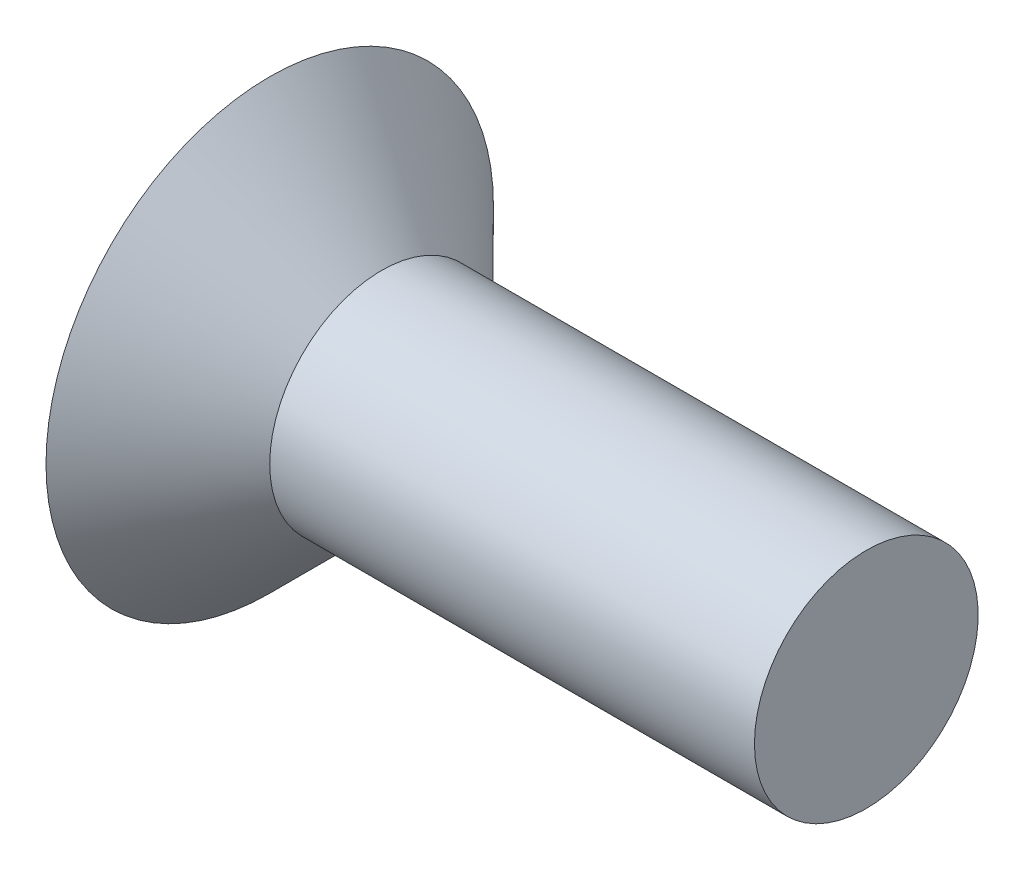
ISO-10303-21;
HEADER;
FILE_DESCRIPTION(('STEP AP214'),'2;1');
FILE_NAME('part.step','',(''),(''),'','','');
FILE_SCHEMA(('AUTOMOTIVE_DESIGN { 1 0 10303 214 1 1 1 1 }'));
ENDSEC;
DATA;
#1=APPLICATION_CONTEXT('core data for automotive mechanical design processes');
#2=APPLICATION_PROTOCOL_DEFINITION('international standard','automotive_design',2000,#1);
#3=PRODUCT_CONTEXT('',#1,'mechanical');
#4=PRODUCT('Part','Part','',(#3));
#5=PRODUCT_RELATED_PRODUCT_CATEGORY('part','',(#4));
#6=PRODUCT_DEFINITION_FORMATION('','',#4);
#7=PRODUCT_DEFINITION_CONTEXT('part definition',#1,'design');
#8=PRODUCT_DEFINITION('design','',#6,#7);
#9=PRODUCT_DEFINITION_SHAPE('','',#8);
#10=(LENGTH_UNIT() NAMED_UNIT(*) SI_UNIT(.MILLI.,.METRE.));
#11=(NAMED_UNIT(*) PLANE_ANGLE_UNIT() SI_UNIT($,.RADIAN.));
#12=(NAMED_UNIT(*) SI_UNIT($,.STERADIAN.) SOLID_ANGLE_UNIT());
#13=UNCERTAINTY_MEASURE_WITH_UNIT(LENGTH_MEASURE(1.E-05),#10,'distance_accuracy_value','');
#14=(GEOMETRIC_REPRESENTATION_CONTEXT(3) GLOBAL_UNCERTAINTY_ASSIGNED_CONTEXT((#13)) GLOBAL_UNIT_ASSIGNED_CONTEXT((#10,
#11,#12)) REPRESENTATION_CONTEXT('',''));
#15=CARTESIAN_POINT('',(0.,0.,0.));
#16=DIRECTION('',(0.,0.,1.));
#17=DIRECTION('',(1.,0.,0.));
#18=AXIS2_PLACEMENT_3D('',#15,#16,#17);
#19=CARTESIAN_POINT('',(0.,0.,0.));
#20=DIRECTION('',(-1.,0.,0.));
#21=DIRECTION('',(0.,0.,1.));
#22=AXIS2_PLACEMENT_3D('',#19,#20,#21);
#23=PLANE('',#22);
#24=DIRECTION('',(0.,0.5,-0.866025403784439));
#25=VECTOR('',#24,1.);
#26=CARTESIAN_POINT('',(0.,0.577350269189626,1.));
#27=LINE('',#26,#25);
#28=CARTESIAN_POINT('',(0.,0.577350269189626,1.));
#29=VERTEX_POINT('',#28);
#30=CARTESIAN_POINT('',(0.,1.15470053837925,0.));
#31=VERTEX_POINT('',#30);
#32=EDGE_CURVE('E50',#29,#31,#27,.T.);
#33=ORIENTED_EDGE('',*,*,#32,.F.);
#34=DIRECTION('',(0.,1.,0.));
#35=VECTOR('',#34,1.);
#36=CARTESIAN_POINT('',(0.,-0.577350269189626,1.));
#37=LINE('',#36,#35);
#38=CARTESIAN_POINT('',(0.,-0.577350269189626,1.));
#39=VERTEX_POINT('',#38);
#40=EDGE_CURVE('E133',#39,#29,#37,.T.);
#41=ORIENTED_EDGE('',*,*,#40,.F.);
#42=DIRECTION('',(0.,0.5,0.866025403784439));
#43=VECTOR('',#42,1.);
#44=CARTESIAN_POINT('',(0.,-1.15470053837925,0.));
#45=LINE('',#44,#43);
#46=CARTESIAN_POINT('',(0.,-1.15470053837925,0.));
#47=VERTEX_POINT('',#46);
#48=EDGE_CURVE('E131',#47,#39,#45,.T.);
#49=ORIENTED_EDGE('',*,*,#48,.F.);
#50=DIRECTION('',(0.,-0.5,0.866025403784439));
#51=VECTOR('',#50,1.);
#52=CARTESIAN_POINT('',(0.,-0.577350269189626,-1.));
#53=LINE('',#52,#51);
#54=CARTESIAN_POINT('',(0.,-0.577350269189626,-1.));
#55=VERTEX_POINT('',#54);
#56=EDGE_CURVE('E98',#55,#47,#53,.T.);
#57=ORIENTED_EDGE('',*,*,#56,.F.);
#58=DIRECTION('',(0.,-1.,0.));
#59=VECTOR('',#58,1.);
#60=CARTESIAN_POINT('',(0.,0.577350269189626,-1.));
#61=LINE('',#60,#59);
#62=CARTESIAN_POINT('',(0.,0.577350269189626,-1.));
#63=VERTEX_POINT('',#62);
#64=EDGE_CURVE('E127',#63,#55,#61,.T.);
#65=ORIENTED_EDGE('',*,*,#64,.F.);
#66=DIRECTION('',(0.,-0.5,-0.866025403784439));
#67=VECTOR('',#66,1.);
#68=CARTESIAN_POINT('',(0.,1.15470053837925,0.));
#69=LINE('',#68,#67);
#70=EDGE_CURVE('E124',#31,#63,#69,.T.);
#71=ORIENTED_EDGE('',*,*,#70,.F.);
#72=EDGE_LOOP('',(#33,#41,#49,#57,#65,#71));
#73=FACE_BOUND('',#72,.T.);
#74=CARTESIAN_POINT('',(0.,0.,0.));
#75=DIRECTION('',(-1.,0.,0.));
#76=DIRECTION('',(0.,0.,1.));
#77=AXIS2_PLACEMENT_3D('',#74,#75,#76);
#78=CIRCLE('',#77,3.);
#79=CARTESIAN_POINT('',(0.,0.,3.));
#80=VERTEX_POINT('',#79);
#81=EDGE_CURVE('E137',#80,#80,#78,.T.);
#82=ORIENTED_EDGE('',*,*,#81,.T.);
#83=EDGE_LOOP('',(#82));
#84=FACE_BOUND('',#83,.T.);
#85=ADVANCED_FACE('F36',(#73,#84),#23,.T.);
#86=CARTESIAN_POINT('',(8.,0.,0.));
#87=DIRECTION('',(-1.,0.,0.));
#88=DIRECTION('',(0.,0.,1.));
#89=AXIS2_PLACEMENT_3D('',#86,#87,#88);
#90=PLANE('',#89);
#91=CARTESIAN_POINT('',(8.,0.,0.));
#92=DIRECTION('',(-1.,0.,0.));
#93=DIRECTION('',(0.,0.,1.));
#94=AXIS2_PLACEMENT_3D('',#91,#92,#93);
#95=CIRCLE('',#94,1.5);
#96=CARTESIAN_POINT('',(8.,0.,1.5));
#97=VERTEX_POINT('',#96);
#98=EDGE_CURVE('E11',#97,#97,#95,.T.);
#99=ORIENTED_EDGE('',*,*,#98,.F.);
#100=EDGE_LOOP('',(#99));
#101=FACE_BOUND('',#100,.T.);
#102=ADVANCED_FACE('F152',(#101),#90,.F.);
#103=CARTESIAN_POINT('',(0.,0.,0.));
#104=DIRECTION('',(-1.,0.,0.));
#105=DIRECTION('',(0.,0.,1.));
#106=AXIS2_PLACEMENT_3D('',#103,#104,#105);
#107=CYLINDRICAL_SURFACE('',#106,1.5);
#108=CARTESIAN_POINT('',(1.50000000000001,0.,0.));
#109=DIRECTION('',(-1.,0.,0.));
#110=DIRECTION('',(0.,0.,1.));
#111=AXIS2_PLACEMENT_3D('',#108,#109,#110);
#112=CIRCLE('',#111,1.5);
#113=CARTESIAN_POINT('',(1.50000000000001,0.,1.5));
#114=VERTEX_POINT('',#113);
#115=EDGE_CURVE('E43',#114,#114,#112,.T.);
#116=ORIENTED_EDGE('',*,*,#115,.F.);
#117=EDGE_LOOP('',(#116));
#118=FACE_BOUND('',#117,.T.);
#119=ORIENTED_EDGE('',*,*,#98,.T.);
#120=EDGE_LOOP('',(#119));
#121=FACE_BOUND('',#120,.T.);
#122=ADVANCED_FACE('F149',(#118,#121),#107,.T.);
#123=CARTESIAN_POINT('',(1.50000000000001,0.,0.));
#124=DIRECTION('',(-1.,0.,0.));
#125=DIRECTION('',(0.,0.,1.));
#126=AXIS2_PLACEMENT_3D('',#123,#124,#125);
#127=CONICAL_SURFACE('',#126,1.5,0.785398163397446);
#128=ORIENTED_EDGE('',*,*,#81,.F.);
#129=EDGE_LOOP('',(#128));
#130=FACE_BOUND('',#129,.T.);
#131=ORIENTED_EDGE('',*,*,#115,.T.);
#132=EDGE_LOOP('',(#131));
#133=FACE_BOUND('',#132,.T.);
#134=ADVANCED_FACE('F147',(#130,#133),#127,.T.);
#135=CARTESIAN_POINT('',(1.,0.577350269189626,1.));
#136=DIRECTION('',(0.,0.866025403784439,0.5));
#137=DIRECTION('',(0.,-0.5,0.866025403784439));
#138=AXIS2_PLACEMENT_3D('',#135,#136,#137);
#139=PLANE('',#138);
#140=ORIENTED_EDGE('',*,*,#32,.T.);
#141=DIRECTION('',(-1.,0.,0.));
#142=VECTOR('',#141,1.);
#143=CARTESIAN_POINT('',(1.,1.15470053837925,0.));
#144=LINE('',#143,#142);
#145=CARTESIAN_POINT('',(1.,1.15470053837925,0.));
#146=VERTEX_POINT('',#145);
#147=EDGE_CURVE('E80',#146,#31,#144,.T.);
#148=ORIENTED_EDGE('',*,*,#147,.F.);
#149=DIRECTION('',(0.,0.5,-0.866025403784439));
#150=VECTOR('',#149,1.);
#151=CARTESIAN_POINT('',(1.,0.577350269189626,1.));
#152=LINE('',#151,#150);
#153=CARTESIAN_POINT('',(1.,0.577350269189626,1.));
#154=VERTEX_POINT('',#153);
#155=EDGE_CURVE('E135',#154,#146,#152,.T.);
#156=ORIENTED_EDGE('',*,*,#155,.F.);
#157=DIRECTION('',(-1.,0.,0.));
#158=VECTOR('',#157,1.);
#159=CARTESIAN_POINT('',(1.,0.577350269189626,1.));
#160=LINE('',#159,#158);
#161=EDGE_CURVE('E58',#154,#29,#160,.T.);
#162=ORIENTED_EDGE('',*,*,#161,.T.);
#163=EDGE_LOOP('',(#140,#148,#156,#162));
#164=FACE_BOUND('',#163,.T.);
#165=ADVANCED_FACE('F164',(#164),#139,.F.);
#166=CARTESIAN_POINT('',(1.,-0.577350269189626,1.));
#167=DIRECTION('',(0.,0.,1.));
#168=DIRECTION('',(1.,0.,0.));
#169=AXIS2_PLACEMENT_3D('',#166,#167,#168);
#170=PLANE('',#169);
#171=ORIENTED_EDGE('',*,*,#40,.T.);
#172=ORIENTED_EDGE('',*,*,#161,.F.);
#173=DIRECTION('',(0.,1.,0.));
#174=VECTOR('',#173,1.);
#175=CARTESIAN_POINT('',(1.,-0.577350269189626,1.));
#176=LINE('',#175,#174);
#177=CARTESIAN_POINT('',(1.,-0.577350269189626,1.));
#178=VERTEX_POINT('',#177);
#179=EDGE_CURVE('E110',#178,#154,#176,.T.);
#180=ORIENTED_EDGE('',*,*,#179,.F.);
#181=DIRECTION('',(-1.,0.,0.));
#182=VECTOR('',#181,1.);
#183=CARTESIAN_POINT('',(1.,-0.577350269189626,1.));
#184=LINE('',#183,#182);
#185=EDGE_CURVE('E102',#178,#39,#184,.T.);
#186=ORIENTED_EDGE('',*,*,#185,.T.);
#187=EDGE_LOOP('',(#171,#172,#180,#186));
#188=FACE_BOUND('',#187,.T.);
#189=ADVANCED_FACE('F168',(#188),#170,.F.);
#190=CARTESIAN_POINT('',(1.,-1.15470053837925,0.));
#191=DIRECTION('',(0.,-0.866025403784439,0.5));
#192=DIRECTION('',(0.,-0.5,-0.866025403784439));
#193=AXIS2_PLACEMENT_3D('',#190,#191,#192);
#194=PLANE('',#193);
#195=ORIENTED_EDGE('',*,*,#48,.T.);
#196=ORIENTED_EDGE('',*,*,#185,.F.);
#197=DIRECTION('',(0.,0.5,0.866025403784439));
#198=VECTOR('',#197,1.);
#199=CARTESIAN_POINT('',(1.,-1.15470053837925,0.));
#200=LINE('',#199,#198);
#201=CARTESIAN_POINT('',(1.,-1.15470053837925,0.));
#202=VERTEX_POINT('',#201);
#203=EDGE_CURVE('E106',#202,#178,#200,.T.);
#204=ORIENTED_EDGE('',*,*,#203,.F.);
#205=DIRECTION('',(-1.,0.,0.));
#206=VECTOR('',#205,1.);
#207=CARTESIAN_POINT('',(1.,-1.15470053837925,0.));
#208=LINE('',#207,#206);
#209=EDGE_CURVE('E91',#202,#47,#208,.T.);
#210=ORIENTED_EDGE('',*,*,#209,.T.);
#211=EDGE_LOOP('',(#195,#196,#204,#210));
#212=FACE_BOUND('',#211,.T.);
#213=ADVANCED_FACE('F107',(#212),#194,.F.);
#214=CARTESIAN_POINT('',(1.,-0.577350269189626,-1.));
#215=DIRECTION('',(0.,-0.866025403784439,-0.5));
#216=DIRECTION('',(0.,0.5,-0.866025403784439));
#217=AXIS2_PLACEMENT_3D('',#214,#215,#216);
#218=PLANE('',#217);
#219=ORIENTED_EDGE('',*,*,#56,.T.);
#220=ORIENTED_EDGE('',*,*,#209,.F.);
#221=DIRECTION('',(0.,-0.5,0.866025403784439));
#222=VECTOR('',#221,1.);
#223=CARTESIAN_POINT('',(1.,-0.577350269189626,-1.));
#224=LINE('',#223,#222);
#225=CARTESIAN_POINT('',(1.,-0.577350269189626,-1.));
#226=VERTEX_POINT('',#225);
#227=EDGE_CURVE('E95',#226,#202,#224,.T.);
#228=ORIENTED_EDGE('',*,*,#227,.F.);
#229=DIRECTION('',(-1.,0.,0.));
#230=VECTOR('',#229,1.);
#231=CARTESIAN_POINT('',(1.,-0.577350269189626,-1.));
#232=LINE('',#231,#230);
#233=EDGE_CURVE('E103',#226,#55,#232,.T.);
#234=ORIENTED_EDGE('',*,*,#233,.T.);
#235=EDGE_LOOP('',(#219,#220,#228,#234));
#236=FACE_BOUND('',#235,.T.);
#237=ADVANCED_FACE('F93',(#236),#218,.F.);
#238=CARTESIAN_POINT('',(1.,0.577350269189626,-1.));
#239=DIRECTION('',(0.,0.,-1.));
#240=DIRECTION('',(-1.,0.,0.));
#241=AXIS2_PLACEMENT_3D('',#238,#239,#240);
#242=PLANE('',#241);
#243=ORIENTED_EDGE('',*,*,#64,.T.);
#244=ORIENTED_EDGE('',*,*,#233,.F.);
#245=DIRECTION('',(0.,-1.,0.));
#246=VECTOR('',#245,1.);
#247=CARTESIAN_POINT('',(1.,0.577350269189626,-1.));
#248=LINE('',#247,#246);
#249=CARTESIAN_POINT('',(1.,0.577350269189626,-1.));
#250=VERTEX_POINT('',#249);
#251=EDGE_CURVE('E116',#250,#226,#248,.T.);
#252=ORIENTED_EDGE('',*,*,#251,.F.);
#253=DIRECTION('',(-1.,0.,0.));
#254=VECTOR('',#253,1.);
#255=CARTESIAN_POINT('',(1.,0.577350269189626,-1.));
#256=LINE('',#255,#254);
#257=EDGE_CURVE('E140',#250,#63,#256,.T.);
#258=ORIENTED_EDGE('',*,*,#257,.T.);
#259=EDGE_LOOP('',(#243,#244,#252,#258));
#260=FACE_BOUND('',#259,.T.);
#261=ADVANCED_FACE('F172',(#260),#242,.F.);
#262=CARTESIAN_POINT('',(1.,1.15470053837925,0.));
#263=DIRECTION('',(0.,0.866025403784439,-0.5));
#264=DIRECTION('',(0.,0.5,0.866025403784439));
#265=AXIS2_PLACEMENT_3D('',#262,#263,#264);
#266=PLANE('',#265);
#267=ORIENTED_EDGE('',*,*,#70,.T.);
#268=ORIENTED_EDGE('',*,*,#257,.F.);
#269=DIRECTION('',(0.,-0.5,-0.866025403784439));
#270=VECTOR('',#269,1.);
#271=CARTESIAN_POINT('',(1.,1.15470053837925,0.));
#272=LINE('',#271,#270);
#273=EDGE_CURVE('E118',#146,#250,#272,.T.);
#274=ORIENTED_EDGE('',*,*,#273,.F.);
#275=ORIENTED_EDGE('',*,*,#147,.T.);
#276=EDGE_LOOP('',(#267,#268,#274,#275));
#277=FACE_BOUND('',#276,.T.);
#278=ADVANCED_FACE('F169',(#277),#266,.F.);
#279=CARTESIAN_POINT('',(1.,0.,0.));
#280=DIRECTION('',(-1.,0.,0.));
#281=DIRECTION('',(0.,0.,1.));
#282=AXIS2_PLACEMENT_3D('',#279,#280,#281);
#283=PLANE('',#282);
#284=ORIENTED_EDGE('',*,*,#155,.T.);
#285=ORIENTED_EDGE('',*,*,#273,.T.);
#286=ORIENTED_EDGE('',*,*,#251,.T.);
#287=ORIENTED_EDGE('',*,*,#227,.T.);
#288=ORIENTED_EDGE('',*,*,#203,.T.);
#289=ORIENTED_EDGE('',*,*,#179,.T.);
#290=EDGE_LOOP('',(#284,#285,#286,#287,#288,#289));
#291=FACE_BOUND('',#290,.T.);
#292=ADVANCED_FACE('F113',(#291),#283,.T.);
#293=CLOSED_SHELL('',(#85,#102,#122,#134,#165,#189,#213,#237,#261,#278,#292));
#294=MANIFOLD_SOLID_BREP('B2',#293);
#295=ADVANCED_BREP_SHAPE_REPRESENTATION('',(#18,#294),#14);
#296=SHAPE_DEFINITION_REPRESENTATION(#9,#295);
ENDSEC;
END-ISO-10303-21;
